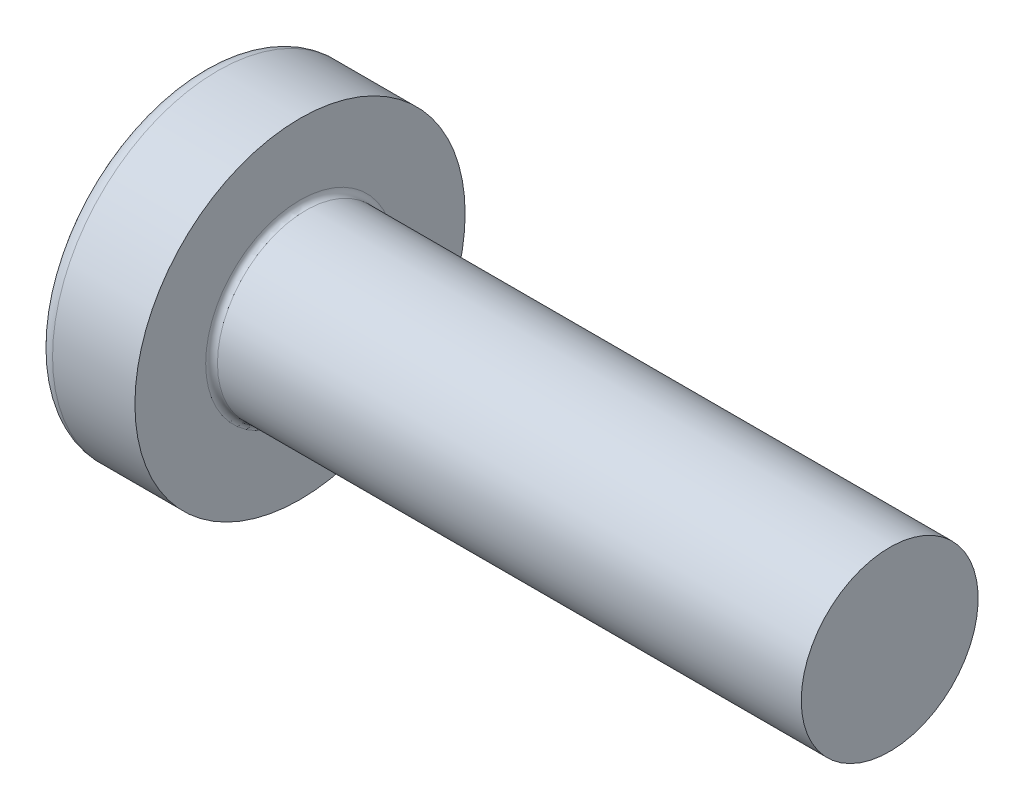
ISO-10303-21;
HEADER;
FILE_DESCRIPTION(('STEP AP214'),'2;1');
FILE_NAME('part.step','',(''),(''),'','','');
FILE_SCHEMA(('AUTOMOTIVE_DESIGN { 1 0 10303 214 1 1 1 1 }'));
ENDSEC;
DATA;
#1=APPLICATION_CONTEXT('core data for automotive mechanical design processes');
#2=APPLICATION_PROTOCOL_DEFINITION('international standard','automotive_design',2000,#1);
#3=PRODUCT_CONTEXT('',#1,'mechanical');
#4=PRODUCT('Part','Part','',(#3));
#5=PRODUCT_RELATED_PRODUCT_CATEGORY('part','',(#4));
#6=PRODUCT_DEFINITION_FORMATION('','',#4);
#7=PRODUCT_DEFINITION_CONTEXT('part definition',#1,'design');
#8=PRODUCT_DEFINITION('design','',#6,#7);
#9=PRODUCT_DEFINITION_SHAPE('','',#8);
#10=(LENGTH_UNIT() NAMED_UNIT(*) SI_UNIT(.MILLI.,.METRE.));
#11=(NAMED_UNIT(*) PLANE_ANGLE_UNIT() SI_UNIT($,.RADIAN.));
#12=(NAMED_UNIT(*) SI_UNIT($,.STERADIAN.) SOLID_ANGLE_UNIT());
#13=UNCERTAINTY_MEASURE_WITH_UNIT(LENGTH_MEASURE(1.E-05),#10,'distance_accuracy_value','');
#14=(GEOMETRIC_REPRESENTATION_CONTEXT(3) GLOBAL_UNCERTAINTY_ASSIGNED_CONTEXT((#13)) GLOBAL_UNIT_ASSIGNED_CONTEXT((#10,
#11,#12)) REPRESENTATION_CONTEXT('',''));
#15=CARTESIAN_POINT('',(0.,0.,0.));
#16=DIRECTION('',(0.,0.,1.));
#17=DIRECTION('',(1.,0.,0.));
#18=AXIS2_PLACEMENT_3D('',#15,#16,#17);
#19=CARTESIAN_POINT('',(5.,0.,0.));
#20=DIRECTION('',(-1.,0.,0.));
#21=DIRECTION('',(0.,1.,0.));
#22=AXIS2_PLACEMENT_3D('',#19,#20,#21);
#23=SPHERICAL_SURFACE('',#22,5.);
#24=CARTESIAN_POINT('',(0.775371598933733,0.,0.));
#25=DIRECTION('',(-1.,0.,0.));
#26=DIRECTION('',(0.,0.,1.));
#27=AXIS2_PLACEMENT_3D('',#24,#25,#26);
#28=CIRCLE('',#27,2.67441860465116);
#29=CARTESIAN_POINT('',(0.775371598933733,0.,2.67441860465116));
#30=VERTEX_POINT('',#29);
#31=EDGE_CURVE('E240',#30,#30,#28,.T.);
#32=ORIENTED_EDGE('',*,*,#31,.T.);
#33=EDGE_LOOP('',(#32));
#34=FACE_BOUND('',#33,.T.);
#35=CARTESIAN_POINT('',(0.0457951200896417,0.,0.));
#36=DIRECTION('',(1.,0.,0.));
#37=DIRECTION('',(0.,0.,-1.));
#38=AXIS2_PLACEMENT_3D('',#35,#36,#37);
#39=CIRCLE('',#38,0.675169614150692);
#40=CARTESIAN_POINT('',(0.0457951200896417,-0.369999999999998,-0.564760133040918));
#41=VERTEX_POINT('',#40);
#42=CARTESIAN_POINT('',(0.0457951200896422,-0.564760133040923,-0.37));
#43=VERTEX_POINT('',#42);
#44=EDGE_CURVE('E376',#41,#43,#39,.F.);
#45=ORIENTED_EDGE('',*,*,#44,.F.);
#46=CARTESIAN_POINT('',(5.,-0.37,0.));
#47=DIRECTION('',(0.,1.,0.));
#48=DIRECTION('',(0.,0.,1.));
#49=AXIS2_PLACEMENT_3D('',#46,#47,#48);
#50=CIRCLE('',#49,4.98629120689917);
#51=CARTESIAN_POINT('',(0.187869734228639,-0.369999999999995,-1.30633162146802));
#52=VERTEX_POINT('',#51);
#53=EDGE_CURVE('E302',#52,#41,#50,.T.);
#54=ORIENTED_EDGE('',*,*,#53,.F.);
#55=CARTESIAN_POINT('',(4.56358262530798,0.,0.87531798330592));
#56=DIRECTION('',(0.446197753347436,0.,-0.894934391398443));
#57=DIRECTION('',(-0.894934391398442,0.,-0.446197753347436));
#58=AXIS2_PLACEMENT_3D('',#55,#56,#57);
#59=CIRCLE('',#58,4.90340272700175);
#60=CARTESIAN_POINT('',(0.187869734228639,0.370000000000005,-1.30633162146802));
#61=VERTEX_POINT('',#60);
#62=EDGE_CURVE('E274',#52,#61,#59,.T.);
#63=ORIENTED_EDGE('',*,*,#62,.T.);
#64=CARTESIAN_POINT('',(5.,0.37,0.));
#65=DIRECTION('',(0.,-1.,0.));
#66=DIRECTION('',(0.,0.,-1.));
#67=AXIS2_PLACEMENT_3D('',#64,#65,#66);
#68=CIRCLE('',#67,4.98629120689917);
#69=CARTESIAN_POINT('',(0.0457951200896407,0.370000000000002,-0.564760133040916));
#70=VERTEX_POINT('',#69);
#71=EDGE_CURVE('E329',#70,#61,#68,.T.);
#72=ORIENTED_EDGE('',*,*,#71,.F.);
#73=CARTESIAN_POINT('',(0.0457951200896422,0.564760133040923,-0.37));
#74=VERTEX_POINT('',#73);
#75=EDGE_CURVE('E395',#74,#70,#39,.F.);
#76=ORIENTED_EDGE('',*,*,#75,.F.);
#77=CARTESIAN_POINT('',(5.,0.,-0.37));
#78=DIRECTION('',(0.,0.,1.));
#79=DIRECTION('',(1.,0.,0.));
#80=AXIS2_PLACEMENT_3D('',#77,#78,#79);
#81=CIRCLE('',#80,4.98629120689917);
#82=CARTESIAN_POINT('',(0.187869734228639,1.30633162146802,-0.37));
#83=VERTEX_POINT('',#82);
#84=EDGE_CURVE('E268',#83,#74,#81,.T.);
#85=ORIENTED_EDGE('',*,*,#84,.F.);
#86=CARTESIAN_POINT('',(4.56358262530798,-0.875317983305919,0.));
#87=DIRECTION('',(0.446197753347436,0.894934391398443,0.));
#88=DIRECTION('',(-0.894934391398443,0.446197753347436,0.));
#89=AXIS2_PLACEMENT_3D('',#86,#87,#88);
#90=CIRCLE('',#89,4.90340272700175);
#91=CARTESIAN_POINT('',(0.187869734228639,1.30633162146802,0.37));
#92=VERTEX_POINT('',#91);
#93=EDGE_CURVE('E271',#83,#92,#90,.T.);
#94=ORIENTED_EDGE('',*,*,#93,.T.);
#95=CARTESIAN_POINT('',(5.,0.,0.37));
#96=DIRECTION('',(0.,0.,-1.));
#97=DIRECTION('',(0.,1.,0.));
#98=AXIS2_PLACEMENT_3D('',#95,#96,#97);
#99=CIRCLE('',#98,4.98629120689917);
#100=CARTESIAN_POINT('',(0.0457951200896417,0.564760133040918,0.37));
#101=VERTEX_POINT('',#100);
#102=EDGE_CURVE('E264',#101,#92,#99,.T.);
#103=ORIENTED_EDGE('',*,*,#102,.F.);
#104=CARTESIAN_POINT('',(0.0457951200896417,0.369999999999998,0.564760133040918));
#105=VERTEX_POINT('',#104);
#106=EDGE_CURVE('E394',#105,#101,#39,.F.);
#107=ORIENTED_EDGE('',*,*,#106,.F.);
#108=CARTESIAN_POINT('',(0.187869734228639,0.369999999999995,1.30633162146802));
#109=VERTEX_POINT('',#108);
#110=EDGE_CURVE('E284',#109,#105,#68,.T.);
#111=ORIENTED_EDGE('',*,*,#110,.F.);
#112=CARTESIAN_POINT('',(4.56358262530798,0.,-0.875317983305919));
#113=DIRECTION('',(0.446197753347436,0.,0.894934391398443));
#114=DIRECTION('',(0.894934391398443,0.,-0.446197753347436));
#115=AXIS2_PLACEMENT_3D('',#112,#113,#114);
#116=CIRCLE('',#115,4.90340272700175);
#117=CARTESIAN_POINT('',(0.187869734228639,-0.370000000000004,1.30633162146802));
#118=VERTEX_POINT('',#117);
#119=EDGE_CURVE('E51',#109,#118,#116,.T.);
#120=ORIENTED_EDGE('',*,*,#119,.T.);
#121=CARTESIAN_POINT('',(0.0457951200896412,-0.370000000000002,0.564760133040916));
#122=VERTEX_POINT('',#121);
#123=EDGE_CURVE('E281',#122,#118,#50,.T.);
#124=ORIENTED_EDGE('',*,*,#123,.F.);
#125=CARTESIAN_POINT('',(0.0457951200896417,-0.564760133040919,0.37));
#126=VERTEX_POINT('',#125);
#127=EDGE_CURVE('E430',#126,#122,#39,.F.);
#128=ORIENTED_EDGE('',*,*,#127,.F.);
#129=CARTESIAN_POINT('',(0.187869734228639,-1.30633162146802,0.37));
#130=VERTEX_POINT('',#129);
#131=EDGE_CURVE('E265',#130,#126,#99,.T.);
#132=ORIENTED_EDGE('',*,*,#131,.F.);
#133=CARTESIAN_POINT('',(4.56358262530798,0.87531798330592,0.));
#134=DIRECTION('',(0.446197753347436,-0.894934391398443,0.));
#135=DIRECTION('',(0.894934391398442,0.446197753347436,0.));
#136=AXIS2_PLACEMENT_3D('',#133,#134,#135);
#137=CIRCLE('',#136,4.90340272700175);
#138=CARTESIAN_POINT('',(0.187869734228639,-1.30633162146802,-0.37));
#139=VERTEX_POINT('',#138);
#140=EDGE_CURVE('E261',#130,#139,#137,.T.);
#141=ORIENTED_EDGE('',*,*,#140,.T.);
#142=EDGE_CURVE('E66',#43,#139,#81,.T.);
#143=ORIENTED_EDGE('',*,*,#142,.F.);
#144=EDGE_LOOP('',(#45,#54,#63,#72,#76,#85,#94,#103,#107,#111,#120,#124,#128,#132,#141,#143));
#145=FACE_BOUND('',#144,.T.);
#146=ADVANCED_FACE('F38',(#34,#145),#23,.T.);
#147=CARTESIAN_POINT('',(1.75,0.527482331818931,-0.37));
#148=DIRECTION('',(0.,0.,1.));
#149=DIRECTION('',(1.,0.,0.));
#150=AXIS2_PLACEMENT_3D('',#147,#148,#149);
#151=PLANE('',#150);
#152=ORIENTED_EDGE('',*,*,#84,.T.);
#153=CARTESIAN_POINT('',(-0.987293237053717,0.649401255967161,-0.37));
#154=CARTESIAN_POINT('',(-0.781914975317086,0.632865887002871,-0.37));
#155=CARTESIAN_POINT('',(-0.576547882393374,0.616188977635081,-0.37));
#156=CARTESIAN_POINT('',(-0.165841599226328,0.582441031964227,-0.37));
#157=CARTESIAN_POINT('',(0.0394975903090438,0.56536998705488,-0.37));
#158=CARTESIAN_POINT('',(0.450133475422571,0.530723441326535,-0.37));
#159=CARTESIAN_POINT('',(0.655430171010572,0.513147940624557,-0.37));
#160=CARTESIAN_POINT('',(1.06596140177933,0.477314957985794,-0.37));
#161=CARTESIAN_POINT('',(1.2711959378071,0.459057485806066,-0.37));
#162=CARTESIAN_POINT('',(1.61065292365625,0.428051938688769,-0.37));
#163=CARTESIAN_POINT('',(1.74490059995642,0.415580824990931,-0.37));
#164=CARTESIAN_POINT('',(2.01334321762763,0.39009202340498,-0.37));
#165=CARTESIAN_POINT('',(2.14753815934577,0.377074339177354,-0.37));
#166=CARTESIAN_POINT('',(2.41586354151957,0.350315629452843,-0.37));
#167=CARTESIAN_POINT('',(2.54999397845309,0.33657456817765,-0.37));
#168=CARTESIAN_POINT('',(2.81814173295471,0.308004077741875,-0.37));
#169=CARTESIAN_POINT('',(2.95215904765134,0.293174621747065,-0.37));
#170=CARTESIAN_POINT('',(3.0860955068368,0.277618485071816,-0.37));
#171=B_SPLINE_CURVE_WITH_KNOTS('',3,(#153,#154,#155,#156,#157,#158,#159,#160,#161,#162,#163,
#164,#165,#166,#167,#168,#169,#170),.UNSPECIFIED.,.F.,.F.,(4,2,2,2,2,2,2,2,4),(0.,
0.618128793984691,1.23627109812525,1.85441325887562,2.4725465791681,2.87702276218609,
3.28149623678161,3.68598973550942,4.09049321032311),.UNSPECIFIED.);
#172=CARTESIAN_POINT('',(1.75,0.415013252800437,-0.37));
#173=VERTEX_POINT('',#172);
#174=EDGE_CURVE('E416',#74,#173,#171,.T.);
#175=ORIENTED_EDGE('',*,*,#174,.T.);
#176=DIRECTION('',(0.,1.,0.));
#177=VECTOR('',#176,1.);
#178=CARTESIAN_POINT('',(1.75,-0.527482331818931,-0.37));
#179=LINE('',#178,#177);
#180=CARTESIAN_POINT('',(1.75,0.527482331818932,-0.37));
#181=VERTEX_POINT('',#180);
#182=EDGE_CURVE('E358',#173,#181,#179,.T.);
#183=ORIENTED_EDGE('',*,*,#182,.T.);
#184=DIRECTION('',(0.894934391398442,-0.446197753347436,0.));
#185=VECTOR('',#184,1.);
#186=CARTESIAN_POINT('',(0.,1.4,-0.37));
#187=LINE('',#186,#185);
#188=EDGE_CURVE('E241',#83,#181,#187,.T.);
#189=ORIENTED_EDGE('',*,*,#188,.F.);
#190=EDGE_LOOP('',(#152,#175,#183,#189));
#191=FACE_BOUND('',#190,.T.);
#192=ADVANCED_FACE('F196',(#191),#151,.T.);
#193=CARTESIAN_POINT('',(1.75,-0.527482331818931,-0.37));
#194=VERTEX_POINT('',#193);
#195=CARTESIAN_POINT('',(1.75,-0.415013252800437,-0.37));
#196=VERTEX_POINT('',#195);
#197=EDGE_CURVE('E249',#194,#196,#179,.T.);
#198=ORIENTED_EDGE('',*,*,#197,.T.);
#199=CARTESIAN_POINT('',(-0.987293237053717,-0.649401255967161,-0.37));
#200=CARTESIAN_POINT('',(-0.781914975317086,-0.632865887002871,-0.37));
#201=CARTESIAN_POINT('',(-0.576547882393374,-0.616188977635081,-0.37));
#202=CARTESIAN_POINT('',(-0.165841599226328,-0.582441031964227,-0.37));
#203=CARTESIAN_POINT('',(0.0394975903090437,-0.56536998705488,-0.37));
#204=CARTESIAN_POINT('',(0.450133475422571,-0.530723441326535,-0.37));
#205=CARTESIAN_POINT('',(0.655430171010572,-0.513147940624557,-0.37));
#206=CARTESIAN_POINT('',(1.06596140177933,-0.477314957985794,-0.37));
#207=CARTESIAN_POINT('',(1.2711959378071,-0.459057485806066,-0.37));
#208=CARTESIAN_POINT('',(1.61065292365625,-0.428051938688769,-0.37));
#209=CARTESIAN_POINT('',(1.74490059995642,-0.415580824990931,-0.37));
#210=CARTESIAN_POINT('',(2.01334321762763,-0.39009202340498,-0.37));
#211=CARTESIAN_POINT('',(2.14753815934577,-0.377074339177353,-0.37));
#212=CARTESIAN_POINT('',(2.41586354151957,-0.350315629452843,-0.37));
#213=CARTESIAN_POINT('',(2.5499939784531,-0.33657456817765,-0.37));
#214=CARTESIAN_POINT('',(2.81814173295471,-0.308004077741875,-0.37));
#215=CARTESIAN_POINT('',(2.95215904765134,-0.293174621747065,-0.37));
#216=CARTESIAN_POINT('',(3.0860955068368,-0.277618485071816,-0.37));
#217=B_SPLINE_CURVE_WITH_KNOTS('',3,(#199,#200,#201,#202,#203,#204,#205,#206,#207,#208,#209,
#210,#211,#212,#213,#214,#215,#216),.UNSPECIFIED.,.F.,.F.,(4,2,2,2,2,2,2,2,4),(0.,
0.618128793984691,1.23627109812525,1.85441325887562,2.4725465791681,2.87702276218609,
3.28149623678161,3.68598973550942,4.09049321032311),.UNSPECIFIED.);
#218=EDGE_CURVE('E393',#196,#43,#217,.F.);
#219=ORIENTED_EDGE('',*,*,#218,.T.);
#220=ORIENTED_EDGE('',*,*,#142,.T.);
#221=DIRECTION('',(0.894934391398442,0.446197753347436,0.));
#222=VECTOR('',#221,1.);
#223=CARTESIAN_POINT('',(0.,-1.4,-0.37));
#224=LINE('',#223,#222);
#225=EDGE_CURVE('E332',#139,#194,#224,.T.);
#226=ORIENTED_EDGE('',*,*,#225,.T.);
#227=EDGE_LOOP('',(#198,#219,#220,#226));
#228=FACE_BOUND('',#227,.T.);
#229=ADVANCED_FACE('F202',(#228),#151,.T.);
#230=CARTESIAN_POINT('',(1.75,-0.527482331818931,0.37));
#231=DIRECTION('',(0.,0.,-1.));
#232=DIRECTION('',(0.,1.,0.));
#233=AXIS2_PLACEMENT_3D('',#230,#231,#232);
#234=PLANE('',#233);
#235=DIRECTION('',(0.,-1.,0.));
#236=VECTOR('',#235,1.);
#237=CARTESIAN_POINT('',(1.75,0.527482331818931,0.37));
#238=LINE('',#237,#236);
#239=CARTESIAN_POINT('',(1.75,0.527482331818932,0.37));
#240=VERTEX_POINT('',#239);
#241=CARTESIAN_POINT('',(1.75,0.415013252800437,0.37));
#242=VERTEX_POINT('',#241);
#243=EDGE_CURVE('E341',#240,#242,#238,.T.);
#244=ORIENTED_EDGE('',*,*,#243,.T.);
#245=CARTESIAN_POINT('',(-0.987293237053717,0.649401255967161,0.37));
#246=CARTESIAN_POINT('',(-0.781914975317086,0.632865887002871,0.37));
#247=CARTESIAN_POINT('',(-0.576547882393374,0.616188977635081,0.37));
#248=CARTESIAN_POINT('',(-0.165841599226328,0.582441031964227,0.37));
#249=CARTESIAN_POINT('',(0.0394975903090437,0.56536998705488,0.37));
#250=CARTESIAN_POINT('',(0.450133475422571,0.530723441326535,0.37));
#251=CARTESIAN_POINT('',(0.655430171010572,0.513147940624557,0.37));
#252=CARTESIAN_POINT('',(1.06596140177933,0.477314957985794,0.37));
#253=CARTESIAN_POINT('',(1.2711959378071,0.459057485806066,0.37));
#254=CARTESIAN_POINT('',(1.61065292365625,0.428051938688769,0.37));
#255=CARTESIAN_POINT('',(1.74490059995642,0.415580824990931,0.37));
#256=CARTESIAN_POINT('',(2.01334321762763,0.39009202340498,0.37));
#257=CARTESIAN_POINT('',(2.14753815934577,0.377074339177353,0.37));
#258=CARTESIAN_POINT('',(2.41586354151957,0.350315629452843,0.37));
#259=CARTESIAN_POINT('',(2.5499939784531,0.33657456817765,0.37));
#260=CARTESIAN_POINT('',(2.81814173295471,0.308004077741875,0.37));
#261=CARTESIAN_POINT('',(2.95215904765134,0.293174621747065,0.37));
#262=CARTESIAN_POINT('',(3.0860955068368,0.277618485071816,0.37));
#263=B_SPLINE_CURVE_WITH_KNOTS('',3,(#245,#246,#247,#248,#249,#250,#251,#252,#253,#254,#255,
#256,#257,#258,#259,#260,#261,#262),.UNSPECIFIED.,.F.,.F.,(4,2,2,2,2,2,2,2,4),(0.,
0.618128793984691,1.23627109812525,1.85441325887562,2.4725465791681,2.87702276218609,
3.28149623678161,3.68598973550942,4.09049321032311),.UNSPECIFIED.);
#264=EDGE_CURVE('E670',#242,#101,#263,.F.);
#265=ORIENTED_EDGE('',*,*,#264,.T.);
#266=ORIENTED_EDGE('',*,*,#102,.T.);
#267=DIRECTION('',(0.894934391398442,-0.446197753347436,0.));
#268=VECTOR('',#267,1.);
#269=CARTESIAN_POINT('',(0.,1.4,0.37));
#270=LINE('',#269,#268);
#271=EDGE_CURVE('E246',#92,#240,#270,.T.);
#272=ORIENTED_EDGE('',*,*,#271,.T.);
#273=EDGE_LOOP('',(#244,#265,#266,#272));
#274=FACE_BOUND('',#273,.T.);
#275=ADVANCED_FACE('F412',(#274),#234,.T.);
#276=ORIENTED_EDGE('',*,*,#131,.T.);
#277=CARTESIAN_POINT('',(-0.987293237069636,-0.649401255968442,0.37));
#278=CARTESIAN_POINT('',(-0.781914975331303,-0.632865887004023,0.37));
#279=CARTESIAN_POINT('',(-0.576547882405889,-0.616188977636102,0.37));
#280=CARTESIAN_POINT('',(-0.165841599235441,-0.582441031964983,0.37));
#281=CARTESIAN_POINT('',(0.0394975903016323,-0.5653699870555,0.37));
#282=CARTESIAN_POINT('',(0.4501334754206,-0.530723441326706,0.37));
#283=CARTESIAN_POINT('',(0.655430171012339,-0.513147940624409,0.37));
#284=CARTESIAN_POINT('',(1.06596140178858,-0.477314957984981,0.37));
#285=CARTESIAN_POINT('',(1.27119593782008,-0.459057485804908,0.37));
#286=CARTESIAN_POINT('',(1.61065292367297,-0.428051938687225,0.37));
#287=CARTESIAN_POINT('',(1.74490059997313,-0.415580824989368,0.37));
#288=CARTESIAN_POINT('',(2.01334321764434,-0.390092023403371,0.37));
#289=CARTESIAN_POINT('',(2.14753815936247,-0.377074339175718,0.37));
#290=CARTESIAN_POINT('',(2.41586354153627,-0.350315629451146,0.37));
#291=CARTESIAN_POINT('',(2.54999397846979,-0.336574568175918,0.37));
#292=CARTESIAN_POINT('',(2.8181417329714,-0.308004077740054,0.37));
#293=CARTESIAN_POINT('',(2.95215904766802,-0.29317462174519,0.37));
#294=CARTESIAN_POINT('',(3.08609550685347,-0.277618485069873,0.37));
#295=B_SPLINE_CURVE_WITH_KNOTS('',3,(#277,#278,#279,#280,#281,#282,#283,#284,#285,#286,#287,
#288,#289,#290,#291,#292,#293,#294),.UNSPECIFIED.,.F.,.F.,(4,2,2,2,2,2,2,2,4),(0.,
0.618128793989811,1.23627109813549,1.85441325889711,2.47254657920086,2.87702276221884,
3.28149623681437,3.68598973554218,4.09049321035586),.UNSPECIFIED.);
#296=CARTESIAN_POINT('',(1.75,-0.415013252800437,0.37));
#297=VERTEX_POINT('',#296);
#298=EDGE_CURVE('E431',#126,#297,#295,.T.);
#299=ORIENTED_EDGE('',*,*,#298,.T.);
#300=CARTESIAN_POINT('',(1.75,-0.527482331818931,0.37));
#301=VERTEX_POINT('',#300);
#302=EDGE_CURVE('E343',#297,#301,#238,.T.);
#303=ORIENTED_EDGE('',*,*,#302,.T.);
#304=DIRECTION('',(0.894934391398442,0.446197753347436,0.));
#305=VECTOR('',#304,1.);
#306=CARTESIAN_POINT('',(0.,-1.4,0.37));
#307=LINE('',#306,#305);
#308=EDGE_CURVE('E334',#130,#301,#307,.T.);
#309=ORIENTED_EDGE('',*,*,#308,.F.);
#310=EDGE_LOOP('',(#276,#299,#303,#309));
#311=FACE_BOUND('',#310,.T.);
#312=ADVANCED_FACE('F516',(#311),#234,.T.);
#313=CARTESIAN_POINT('',(1.75,0.527482331818931,0.37));
#314=DIRECTION('',(0.446197753347436,0.894934391398443,0.));
#315=DIRECTION('',(-0.894934391398443,0.446197753347436,0.));
#316=AXIS2_PLACEMENT_3D('',#313,#314,#315);
#317=PLANE('',#316);
#318=CARTESIAN_POINT('',(2.6696526882832,0.0689604923233251,0.));
#319=DIRECTION('',(0.446197753347436,0.894934391398443,0.));
#320=DIRECTION('',(-0.894934391398443,0.446197753347436,0.));
#321=AXIS2_PLACEMENT_3D('',#318,#319,#320);
#322=ELLIPSE('',#321,1.10195897609154,0.486831694838766);
#323=CARTESIAN_POINT('',(1.75,0.527482331818932,0.175779377683681));
#324=VERTEX_POINT('',#323);
#325=CARTESIAN_POINT('',(1.75,0.527482331818932,-0.175779377683681));
#326=VERTEX_POINT('',#325);
#327=EDGE_CURVE('E307',#324,#326,#322,.F.);
#328=ORIENTED_EDGE('',*,*,#327,.F.);
#329=DIRECTION('',(0.,0.,-1.));
#330=VECTOR('',#329,1.);
#331=CARTESIAN_POINT('',(1.75,0.527482331818931,0.37));
#332=LINE('',#331,#330);
#333=EDGE_CURVE('E344',#240,#324,#332,.T.);
#334=ORIENTED_EDGE('',*,*,#333,.F.);
#335=ORIENTED_EDGE('',*,*,#271,.F.);
#336=ORIENTED_EDGE('',*,*,#93,.F.);
#337=ORIENTED_EDGE('',*,*,#188,.T.);
#338=EDGE_CURVE('E346',#326,#181,#332,.T.);
#339=ORIENTED_EDGE('',*,*,#338,.F.);
#340=EDGE_LOOP('',(#328,#334,#335,#336,#337,#339));
#341=FACE_BOUND('',#340,.T.);
#342=ADVANCED_FACE('F410',(#341),#317,.F.);
#343=CARTESIAN_POINT('',(0.,-1.4,-0.37));
#344=DIRECTION('',(0.446197753347436,-0.894934391398443,0.));
#345=DIRECTION('',(0.894934391398442,0.446197753347436,0.));
#346=AXIS2_PLACEMENT_3D('',#343,#344,#345);
#347=PLANE('',#346);
#348=CARTESIAN_POINT('',(2.6696526882832,-0.0689604923233248,0.));
#349=DIRECTION('',(0.446197753347436,-0.894934391398443,0.));
#350=DIRECTION('',(-0.894934391398443,-0.446197753347436,0.));
#351=AXIS2_PLACEMENT_3D('',#348,#349,#350);
#352=ELLIPSE('',#351,1.10195897609154,0.486831694838766);
#353=CARTESIAN_POINT('',(1.75,-0.527482331818932,-0.175779377683682));
#354=VERTEX_POINT('',#353);
#355=CARTESIAN_POINT('',(1.75,-0.527482331818932,0.175779377683682));
#356=VERTEX_POINT('',#355);
#357=EDGE_CURVE('E672',#354,#356,#352,.F.);
#358=ORIENTED_EDGE('',*,*,#357,.F.);
#359=DIRECTION('',(0.,0.,1.));
#360=VECTOR('',#359,1.);
#361=CARTESIAN_POINT('',(1.75,-0.527482331818931,-0.37));
#362=LINE('',#361,#360);
#363=EDGE_CURVE('E337',#194,#354,#362,.T.);
#364=ORIENTED_EDGE('',*,*,#363,.F.);
#365=ORIENTED_EDGE('',*,*,#225,.F.);
#366=ORIENTED_EDGE('',*,*,#140,.F.);
#367=ORIENTED_EDGE('',*,*,#308,.T.);
#368=EDGE_CURVE('E340',#356,#301,#362,.T.);
#369=ORIENTED_EDGE('',*,*,#368,.F.);
#370=EDGE_LOOP('',(#358,#364,#365,#366,#367,#369));
#371=FACE_BOUND('',#370,.T.);
#372=ADVANCED_FACE('F503',(#371),#347,.F.);
#373=CARTESIAN_POINT('',(1.75,0.527482331818931,-0.37));
#374=DIRECTION('',(-1.,0.,0.));
#375=DIRECTION('',(0.,0.,1.));
#376=AXIS2_PLACEMENT_3D('',#373,#374,#375);
#377=PLANE('',#376);
#378=DIRECTION('',(0.,1.,0.));
#379=VECTOR('',#378,1.);
#380=CARTESIAN_POINT('',(1.75,-0.370000000000002,0.52748233181893));
#381=LINE('',#380,#379);
#382=CARTESIAN_POINT('',(1.75,-0.370000000000002,0.52748233181893));
#383=VERTEX_POINT('',#382);
#384=CARTESIAN_POINT('',(1.75,-0.175779377683684,0.527482331818931));
#385=VERTEX_POINT('',#384);
#386=EDGE_CURVE('E322',#383,#385,#381,.T.);
#387=ORIENTED_EDGE('',*,*,#386,.T.);
#388=CARTESIAN_POINT('',(1.75,0.,0.));
#389=DIRECTION('',(-1.,0.,0.));
#390=DIRECTION('',(0.,0.,1.));
#391=AXIS2_PLACEMENT_3D('',#388,#389,#390);
#392=CIRCLE('',#391,0.556);
#393=CARTESIAN_POINT('',(1.75,-0.370000000000001,0.415013252800436));
#394=VERTEX_POINT('',#393);
#395=EDGE_CURVE('E698',#394,#385,#392,.T.);
#396=ORIENTED_EDGE('',*,*,#395,.F.);
#397=DIRECTION('',(0.,0.,-1.));
#398=VECTOR('',#397,1.);
#399=CARTESIAN_POINT('',(1.75,-0.370000000000002,0.52748233181893));
#400=LINE('',#399,#398);
#401=EDGE_CURVE('E318',#383,#394,#400,.T.);
#402=ORIENTED_EDGE('',*,*,#401,.F.);
#403=EDGE_LOOP('',(#387,#396,#402));
#404=FACE_BOUND('',#403,.T.);
#405=ADVANCED_FACE('F496',(#404),#377,.T.);
#406=ORIENTED_EDGE('',*,*,#302,.F.);
#407=EDGE_CURVE('E703',#356,#297,#392,.T.);
#408=ORIENTED_EDGE('',*,*,#407,.F.);
#409=ORIENTED_EDGE('',*,*,#368,.T.);
#410=EDGE_LOOP('',(#406,#408,#409));
#411=FACE_BOUND('',#410,.T.);
#412=ADVANCED_FACE('F489',(#411),#377,.T.);
#413=ORIENTED_EDGE('',*,*,#363,.T.);
#414=EDGE_CURVE('E387',#196,#354,#392,.T.);
#415=ORIENTED_EDGE('',*,*,#414,.F.);
#416=ORIENTED_EDGE('',*,*,#197,.F.);
#417=EDGE_LOOP('',(#413,#415,#416));
#418=FACE_BOUND('',#417,.T.);
#419=ADVANCED_FACE('F483',(#418),#377,.T.);
#420=CARTESIAN_POINT('',(1.75,-0.369999999999998,-0.415013252800438));
#421=VERTEX_POINT('',#420);
#422=CARTESIAN_POINT('',(1.75,-0.369999999999998,-0.527482331818932));
#423=VERTEX_POINT('',#422);
#424=EDGE_CURVE('E321',#421,#423,#400,.T.);
#425=ORIENTED_EDGE('',*,*,#424,.F.);
#426=CARTESIAN_POINT('',(1.75,-0.175779377683682,-0.527482331818932));
#427=VERTEX_POINT('',#426);
#428=EDGE_CURVE('E58',#427,#421,#392,.T.);
#429=ORIENTED_EDGE('',*,*,#428,.F.);
#430=DIRECTION('',(0.,-1.,0.));
#431=VECTOR('',#430,1.);
#432=CARTESIAN_POINT('',(1.75,0.370000000000002,-0.52748233181893));
#433=LINE('',#432,#431);
#434=EDGE_CURVE('E317',#427,#423,#433,.T.);
#435=ORIENTED_EDGE('',*,*,#434,.T.);
#436=EDGE_LOOP('',(#425,#429,#435));
#437=FACE_BOUND('',#436,.T.);
#438=ADVANCED_FACE('F382',(#437),#377,.T.);
#439=CARTESIAN_POINT('',(1.75,0.370000000000002,-0.52748233181893));
#440=VERTEX_POINT('',#439);
#441=CARTESIAN_POINT('',(1.75,0.175779377683685,-0.527482331818931));
#442=VERTEX_POINT('',#441);
#443=EDGE_CURVE('E314',#440,#442,#433,.T.);
#444=ORIENTED_EDGE('',*,*,#443,.T.);
#445=CARTESIAN_POINT('',(1.75,0.370000000000001,-0.415013252800436));
#446=VERTEX_POINT('',#445);
#447=EDGE_CURVE('E386',#446,#442,#392,.T.);
#448=ORIENTED_EDGE('',*,*,#447,.F.);
#449=DIRECTION('',(0.,0.,1.));
#450=VECTOR('',#449,1.);
#451=CARTESIAN_POINT('',(1.75,0.370000000000002,-0.52748233181893));
#452=LINE('',#451,#450);
#453=EDGE_CURVE('E326',#440,#446,#452,.T.);
#454=ORIENTED_EDGE('',*,*,#453,.F.);
#455=EDGE_LOOP('',(#444,#448,#454));
#456=FACE_BOUND('',#455,.T.);
#457=ADVANCED_FACE('F471',(#456),#377,.T.);
#458=ORIENTED_EDGE('',*,*,#182,.F.);
#459=EDGE_CURVE('E687',#326,#173,#392,.T.);
#460=ORIENTED_EDGE('',*,*,#459,.F.);
#461=ORIENTED_EDGE('',*,*,#338,.T.);
#462=EDGE_LOOP('',(#458,#460,#461));
#463=FACE_BOUND('',#462,.T.);
#464=ADVANCED_FACE('F464',(#463),#377,.T.);
#465=ORIENTED_EDGE('',*,*,#333,.T.);
#466=EDGE_CURVE('E689',#242,#324,#392,.T.);
#467=ORIENTED_EDGE('',*,*,#466,.F.);
#468=ORIENTED_EDGE('',*,*,#243,.F.);
#469=EDGE_LOOP('',(#465,#467,#468));
#470=FACE_BOUND('',#469,.T.);
#471=ADVANCED_FACE('F458',(#470),#377,.T.);
#472=CARTESIAN_POINT('',(1.75,0.369999999999998,0.527482331818933));
#473=DIRECTION('',(0.,-1.,0.));
#474=DIRECTION('',(1.,0.,0.));
#475=AXIS2_PLACEMENT_3D('',#472,#473,#474);
#476=PLANE('',#475);
#477=ORIENTED_EDGE('',*,*,#110,.T.);
#478=CARTESIAN_POINT('',(-0.987293237069636,0.369999999999998,0.649401255968443));
#479=CARTESIAN_POINT('',(-0.781914975331303,0.369999999999998,0.632865887004024));
#480=CARTESIAN_POINT('',(-0.576547882405889,0.369999999999998,0.616188977636103));
#481=CARTESIAN_POINT('',(-0.165841599235441,0.369999999999998,0.582441031964984));
#482=CARTESIAN_POINT('',(0.0394975903016326,0.369999999999998,0.565369987055501));
#483=CARTESIAN_POINT('',(0.4501334754206,0.369999999999998,0.530723441326707));
#484=CARTESIAN_POINT('',(0.655430171012339,0.369999999999998,0.51314794062441));
#485=CARTESIAN_POINT('',(1.06596140178858,0.369999999999998,0.477314957984982));
#486=CARTESIAN_POINT('',(1.27119593782008,0.369999999999998,0.459057485804909));
#487=CARTESIAN_POINT('',(1.61065292367297,0.369999999999998,0.428051938687226));
#488=CARTESIAN_POINT('',(1.74490059997313,0.369999999999999,0.415580824989369));
#489=CARTESIAN_POINT('',(2.01334321764434,0.369999999999999,0.390092023403372));
#490=CARTESIAN_POINT('',(2.14753815936247,0.369999999999999,0.37707433917572));
#491=CARTESIAN_POINT('',(2.41586354153627,0.369999999999999,0.350315629451147));
#492=CARTESIAN_POINT('',(2.54999397846979,0.369999999999999,0.336574568175919));
#493=CARTESIAN_POINT('',(2.8181417329714,0.369999999999999,0.308004077740055));
#494=CARTESIAN_POINT('',(2.95215904766802,0.369999999999999,0.293174621745191));
#495=CARTESIAN_POINT('',(3.08609550685347,0.369999999999999,0.277618485069875));
#496=B_SPLINE_CURVE_WITH_KNOTS('',3,(#478,#479,#480,#481,#482,#483,#484,#485,#486,#487,#488,
#489,#490,#491,#492,#493,#494,#495),.UNSPECIFIED.,.F.,.F.,(4,2,2,2,2,2,2,2,4),(0.,
0.61812879398981,1.23627109813549,1.85441325889711,2.47254657920086,2.87702276221884,
3.28149623681436,3.68598973554218,4.09049321035586),.UNSPECIFIED.);
#497=CARTESIAN_POINT('',(1.75,0.369999999999999,0.415013252800439));
#498=VERTEX_POINT('',#497);
#499=EDGE_CURVE('E669',#105,#498,#496,.T.);
#500=ORIENTED_EDGE('',*,*,#499,.T.);
#501=CARTESIAN_POINT('',(1.75,0.369999999999998,0.527482331818933));
#502=VERTEX_POINT('',#501);
#503=EDGE_CURVE('E299',#498,#502,#452,.T.);
#504=ORIENTED_EDGE('',*,*,#503,.T.);
#505=DIRECTION('',(0.894934391398442,0.,-0.446197753347436));
#506=VECTOR('',#505,1.);
#507=CARTESIAN_POINT('',(0.,0.369999999999995,1.4));
#508=LINE('',#507,#506);
#509=EDGE_CURVE('E292',#109,#502,#508,.T.);
#510=ORIENTED_EDGE('',*,*,#509,.F.);
#511=EDGE_LOOP('',(#477,#500,#504,#510));
#512=FACE_BOUND('',#511,.T.);
#513=ADVANCED_FACE('F296',(#512),#476,.T.);
#514=CARTESIAN_POINT('',(1.75,-0.369999999999998,-0.527482331818932));
#515=DIRECTION('',(0.,1.,0.));
#516=DIRECTION('',(0.,0.,1.));
#517=AXIS2_PLACEMENT_3D('',#514,#515,#516);
#518=PLANE('',#517);
#519=ORIENTED_EDGE('',*,*,#401,.T.);
#520=CARTESIAN_POINT('',(-0.987293237053717,-0.370000000000002,0.649401255967159));
#521=CARTESIAN_POINT('',(-0.781914975317086,-0.370000000000002,0.63286588700287));
#522=CARTESIAN_POINT('',(-0.576547882393374,-0.370000000000002,0.61618897763508));
#523=CARTESIAN_POINT('',(-0.165841599226329,-0.370000000000002,0.582441031964225));
#524=CARTESIAN_POINT('',(0.0394975903090434,-0.370000000000002,0.565369987054878));
#525=CARTESIAN_POINT('',(0.450133475422571,-0.370000000000002,0.530723441326534));
#526=CARTESIAN_POINT('',(0.655430171010572,-0.370000000000002,0.513147940624556));
#527=CARTESIAN_POINT('',(1.06596140177933,-0.370000000000002,0.477314957985793));
#528=CARTESIAN_POINT('',(1.2711959378071,-0.370000000000002,0.459057485806065));
#529=CARTESIAN_POINT('',(1.61065292365625,-0.370000000000001,0.428051938688768));
#530=CARTESIAN_POINT('',(1.74490059995642,-0.370000000000001,0.41558082499093));
#531=CARTESIAN_POINT('',(2.01334321762763,-0.370000000000001,0.390092023404978));
#532=CARTESIAN_POINT('',(2.14753815934577,-0.370000000000001,0.377074339177352));
#533=CARTESIAN_POINT('',(2.41586354151957,-0.370000000000001,0.350315629452841));
#534=CARTESIAN_POINT('',(2.54999397845309,-0.370000000000001,0.336574568177649));
#535=CARTESIAN_POINT('',(2.81814173295471,-0.370000000000001,0.308004077741874));
#536=CARTESIAN_POINT('',(2.95215904765134,-0.370000000000001,0.293174621747064));
#537=CARTESIAN_POINT('',(3.0860955068368,-0.370000000000001,0.277618485071815));
#538=B_SPLINE_CURVE_WITH_KNOTS('',3,(#520,#521,#522,#523,#524,#525,#526,#527,#528,#529,#530,
#531,#532,#533,#534,#535,#536,#537),.UNSPECIFIED.,.F.,.F.,(4,2,2,2,2,2,2,2,4),(0.,
0.61812879398469,1.23627109812525,1.85441325887562,2.4725465791681,2.87702276218609,
3.28149623678161,3.68598973550942,4.09049321032311),.UNSPECIFIED.);
#539=EDGE_CURVE('E424',#394,#122,#538,.F.);
#540=ORIENTED_EDGE('',*,*,#539,.T.);
#541=ORIENTED_EDGE('',*,*,#123,.T.);
#542=DIRECTION('',(0.894934391398442,0.,-0.446197753347436));
#543=VECTOR('',#542,1.);
#544=CARTESIAN_POINT('',(0.,-0.370000000000005,1.4));
#545=LINE('',#544,#543);
#546=EDGE_CURVE('E294',#118,#383,#545,.T.);
#547=ORIENTED_EDGE('',*,*,#546,.T.);
#548=EDGE_LOOP('',(#519,#540,#541,#547));
#549=FACE_BOUND('',#548,.T.);
#550=ADVANCED_FACE('F231',(#549),#518,.T.);
#551=CARTESIAN_POINT('',(1.75,-0.370000000000002,0.52748233181893));
#552=DIRECTION('',(0.446197753347436,0.,0.894934391398443));
#553=DIRECTION('',(-0.894934391398443,0.,0.446197753347436));
#554=AXIS2_PLACEMENT_3D('',#551,#552,#553);
#555=PLANE('',#554);
#556=CARTESIAN_POINT('',(2.6696526882832,0.,0.0689604923233251));
#557=DIRECTION('',(0.446197753347436,0.,0.894934391398443));
#558=DIRECTION('',(-0.894934391398443,0.,0.446197753347436));
#559=AXIS2_PLACEMENT_3D('',#556,#557,#558);
#560=ELLIPSE('',#559,1.10195897609154,0.486831694838766);
#561=CARTESIAN_POINT('',(1.75,0.175779377683681,0.527482331818932));
#562=VERTEX_POINT('',#561);
#563=EDGE_CURVE('E422',#385,#562,#560,.F.);
#564=ORIENTED_EDGE('',*,*,#563,.F.);
#565=ORIENTED_EDGE('',*,*,#386,.F.);
#566=ORIENTED_EDGE('',*,*,#546,.F.);
#567=ORIENTED_EDGE('',*,*,#119,.F.);
#568=ORIENTED_EDGE('',*,*,#509,.T.);
#569=EDGE_CURVE('E325',#562,#502,#381,.T.);
#570=ORIENTED_EDGE('',*,*,#569,.F.);
#571=EDGE_LOOP('',(#564,#565,#566,#567,#568,#570));
#572=FACE_BOUND('',#571,.T.);
#573=ADVANCED_FACE('F290',(#572),#555,.F.);
#574=CARTESIAN_POINT('',(0.,0.370000000000005,-1.4));
#575=DIRECTION('',(0.446197753347436,0.,-0.894934391398443));
#576=DIRECTION('',(0.894934391398442,0.,0.446197753347436));
#577=AXIS2_PLACEMENT_3D('',#574,#575,#576);
#578=PLANE('',#577);
#579=CARTESIAN_POINT('',(2.6696526882832,0.,-0.0689604923233247));
#580=DIRECTION('',(0.446197753347436,0.,-0.894934391398443));
#581=DIRECTION('',(-0.894934391398443,0.,-0.446197753347436));
#582=AXIS2_PLACEMENT_3D('',#579,#580,#581);
#583=ELLIPSE('',#582,1.10195897609154,0.486831694838766);
#584=EDGE_CURVE('E380',#442,#427,#583,.F.);
#585=ORIENTED_EDGE('',*,*,#584,.F.);
#586=ORIENTED_EDGE('',*,*,#443,.F.);
#587=DIRECTION('',(0.894934391398442,0.,0.446197753347436));
#588=VECTOR('',#587,1.);
#589=CARTESIAN_POINT('',(0.,0.370000000000005,-1.4));
#590=LINE('',#589,#588);
#591=EDGE_CURVE('E304',#61,#440,#590,.T.);
#592=ORIENTED_EDGE('',*,*,#591,.F.);
#593=ORIENTED_EDGE('',*,*,#62,.F.);
#594=DIRECTION('',(0.894934391398442,0.,0.446197753347436));
#595=VECTOR('',#594,1.);
#596=CARTESIAN_POINT('',(0.,-0.369999999999995,-1.4));
#597=LINE('',#596,#595);
#598=EDGE_CURVE('E311',#52,#423,#597,.T.);
#599=ORIENTED_EDGE('',*,*,#598,.T.);
#600=ORIENTED_EDGE('',*,*,#434,.F.);
#601=EDGE_LOOP('',(#585,#586,#592,#593,#599,#600));
#602=FACE_BOUND('',#601,.T.);
#603=ADVANCED_FACE('F371',(#602),#578,.F.);
#604=ORIENTED_EDGE('',*,*,#453,.T.);
#605=CARTESIAN_POINT('',(-0.987293237053717,0.370000000000002,-0.649401255967159));
#606=CARTESIAN_POINT('',(-0.781914975317086,0.370000000000002,-0.63286588700287));
#607=CARTESIAN_POINT('',(-0.576547882393374,0.370000000000002,-0.616188977635079));
#608=CARTESIAN_POINT('',(-0.165841599226329,0.370000000000002,-0.582441031964226));
#609=CARTESIAN_POINT('',(0.0394975903090435,0.370000000000002,-0.565369987054878));
#610=CARTESIAN_POINT('',(0.450133475422571,0.370000000000002,-0.530723441326534));
#611=CARTESIAN_POINT('',(0.655430171010572,0.370000000000002,-0.513147940624556));
#612=CARTESIAN_POINT('',(1.06596140177933,0.370000000000002,-0.477314957985793));
#613=CARTESIAN_POINT('',(1.2711959378071,0.370000000000002,-0.459057485806065));
#614=CARTESIAN_POINT('',(1.61065292365625,0.370000000000001,-0.428051938688767));
#615=CARTESIAN_POINT('',(1.74490059995642,0.370000000000001,-0.41558082499093));
#616=CARTESIAN_POINT('',(2.01334321762763,0.370000000000001,-0.390092023404978));
#617=CARTESIAN_POINT('',(2.14753815934577,0.370000000000001,-0.377074339177352));
#618=CARTESIAN_POINT('',(2.41586354151957,0.370000000000001,-0.350315629452841));
#619=CARTESIAN_POINT('',(2.5499939784531,0.370000000000001,-0.336574568177649));
#620=CARTESIAN_POINT('',(2.81814173295471,0.370000000000001,-0.308004077741874));
#621=CARTESIAN_POINT('',(2.95215904765134,0.370000000000001,-0.293174621747064));
#622=CARTESIAN_POINT('',(3.0860955068368,0.370000000000001,-0.277618485071815));
#623=B_SPLINE_CURVE_WITH_KNOTS('',3,(#605,#606,#607,#608,#609,#610,#611,#612,#613,#614,#615,
#616,#617,#618,#619,#620,#621,#622),.UNSPECIFIED.,.F.,.F.,(4,2,2,2,2,2,2,2,4),(0.,
0.618128793984691,1.23627109812525,1.85441325887562,2.4725465791681,2.87702276218609,
3.28149623678161,3.68598973550942,4.09049321032311),.UNSPECIFIED.);
#624=EDGE_CURVE('E367',#446,#70,#623,.F.);
#625=ORIENTED_EDGE('',*,*,#624,.T.);
#626=ORIENTED_EDGE('',*,*,#71,.T.);
#627=ORIENTED_EDGE('',*,*,#591,.T.);
#628=EDGE_LOOP('',(#604,#625,#626,#627));
#629=FACE_BOUND('',#628,.T.);
#630=ADVANCED_FACE('F229',(#629),#476,.T.);
#631=ORIENTED_EDGE('',*,*,#53,.T.);
#632=CARTESIAN_POINT('',(-0.987293237069636,-0.369999999999997,-0.649401255968443));
#633=CARTESIAN_POINT('',(-0.781914975331303,-0.369999999999997,-0.632865887004025));
#634=CARTESIAN_POINT('',(-0.57654788240589,-0.369999999999997,-0.616188977636104));
#635=CARTESIAN_POINT('',(-0.165841599235441,-0.369999999999998,-0.582441031964984));
#636=CARTESIAN_POINT('',(0.0394975903016322,-0.369999999999998,-0.565369987055501));
#637=CARTESIAN_POINT('',(0.450133475420599,-0.369999999999998,-0.530723441326707));
#638=CARTESIAN_POINT('',(0.655430171012339,-0.369999999999998,-0.51314794062441));
#639=CARTESIAN_POINT('',(1.06596140178858,-0.369999999999998,-0.477314957984982));
#640=CARTESIAN_POINT('',(1.27119593782008,-0.369999999999998,-0.459057485804909));
#641=CARTESIAN_POINT('',(1.61065292367297,-0.369999999999998,-0.428051938687226));
#642=CARTESIAN_POINT('',(1.74490059997313,-0.369999999999998,-0.415580824989369));
#643=CARTESIAN_POINT('',(2.01334321764433,-0.369999999999999,-0.390092023403372));
#644=CARTESIAN_POINT('',(2.14753815936247,-0.369999999999999,-0.37707433917572));
#645=CARTESIAN_POINT('',(2.41586354153627,-0.369999999999999,-0.350315629451147));
#646=CARTESIAN_POINT('',(2.54999397846979,-0.369999999999999,-0.33657456817592));
#647=CARTESIAN_POINT('',(2.8181417329714,-0.369999999999999,-0.308004077740055));
#648=CARTESIAN_POINT('',(2.95215904766802,-0.369999999999999,-0.293174621745191));
#649=CARTESIAN_POINT('',(3.08609550685347,-0.369999999999999,-0.277618485069875));
#650=B_SPLINE_CURVE_WITH_KNOTS('',3,(#632,#633,#634,#635,#636,#637,#638,#639,#640,#641,#642,
#643,#644,#645,#646,#647,#648,#649),.UNSPECIFIED.,.F.,.F.,(4,2,2,2,2,2,2,2,4),(0.,
0.61812879398981,1.23627109813549,1.85441325889711,2.47254657920086,2.87702276221884,
3.28149623681436,3.68598973554218,4.09049321035586),.UNSPECIFIED.);
#651=EDGE_CURVE('E11',#41,#421,#650,.T.);
#652=ORIENTED_EDGE('',*,*,#651,.T.);
#653=ORIENTED_EDGE('',*,*,#424,.T.);
#654=ORIENTED_EDGE('',*,*,#598,.F.);
#655=EDGE_LOOP('',(#631,#652,#653,#654));
#656=FACE_BOUND('',#655,.T.);
#657=ADVANCED_FACE('F224',(#656),#518,.T.);
#658=CARTESIAN_POINT('',(-25.4,0.,0.));
#659=DIRECTION('',(-1.,0.,0.));
#660=DIRECTION('',(0.,0.,1.));
#661=AXIS2_PLACEMENT_3D('',#658,#659,#660);
#662=CYLINDRICAL_SURFACE('',#661,1.5);
#663=CARTESIAN_POINT('',(2.5,0.,0.));
#664=DIRECTION('',(-1.,0.,0.));
#665=DIRECTION('',(0.,0.,1.));
#666=AXIS2_PLACEMENT_3D('',#663,#664,#665);
#667=CIRCLE('',#666,1.5);
#668=CARTESIAN_POINT('',(2.5,0.,1.5));
#669=VERTEX_POINT('',#668);
#670=EDGE_CURVE('E235',#669,#669,#667,.F.);
#671=ORIENTED_EDGE('',*,*,#670,.T.);
#672=EDGE_LOOP('',(#671));
#673=FACE_BOUND('',#672,.T.);
#674=CARTESIAN_POINT('',(12.4,0.,0.));
#675=DIRECTION('',(-1.,0.,0.));
#676=DIRECTION('',(0.,0.,1.));
#677=AXIS2_PLACEMENT_3D('',#674,#675,#676);
#678=CIRCLE('',#677,1.5);
#679=CARTESIAN_POINT('',(12.4,0.,1.5));
#680=VERTEX_POINT('',#679);
#681=EDGE_CURVE('E238',#680,#680,#678,.T.);
#682=ORIENTED_EDGE('',*,*,#681,.T.);
#683=EDGE_LOOP('',(#682));
#684=FACE_BOUND('',#683,.T.);
#685=ADVANCED_FACE('F221',(#673,#684),#662,.T.);
#686=CARTESIAN_POINT('',(2.4,1.5,0.));
#687=DIRECTION('',(-1.,0.,0.));
#688=DIRECTION('',(0.,0.,1.));
#689=AXIS2_PLACEMENT_3D('',#686,#687,#688);
#690=PLANE('',#689);
#691=CARTESIAN_POINT('',(2.4,0.,0.));
#692=DIRECTION('',(-1.,0.,0.));
#693=DIRECTION('',(0.,0.,1.));
#694=AXIS2_PLACEMENT_3D('',#691,#692,#693);
#695=CIRCLE('',#694,1.6);
#696=CARTESIAN_POINT('',(2.4,0.,1.6));
#697=VERTEX_POINT('',#696);
#698=EDGE_CURVE('E257',#697,#697,#695,.T.);
#699=ORIENTED_EDGE('',*,*,#698,.T.);
#700=EDGE_LOOP('',(#699));
#701=FACE_BOUND('',#700,.T.);
#702=CARTESIAN_POINT('',(2.4,0.,0.));
#703=DIRECTION('',(-1.,0.,0.));
#704=DIRECTION('',(0.,0.,1.));
#705=AXIS2_PLACEMENT_3D('',#702,#703,#704);
#706=CIRCLE('',#705,2.8);
#707=CARTESIAN_POINT('',(2.4,0.,2.8));
#708=VERTEX_POINT('',#707);
#709=EDGE_CURVE('E254',#708,#708,#706,.T.);
#710=ORIENTED_EDGE('',*,*,#709,.F.);
#711=EDGE_LOOP('',(#710));
#712=FACE_BOUND('',#711,.T.);
#713=ADVANCED_FACE('F218',(#701,#712),#690,.F.);
#714=CARTESIAN_POINT('',(-25.4,0.,0.));
#715=DIRECTION('',(-1.,0.,0.));
#716=DIRECTION('',(0.,0.,1.));
#717=AXIS2_PLACEMENT_3D('',#714,#715,#716);
#718=CYLINDRICAL_SURFACE('',#717,2.8);
#719=ORIENTED_EDGE('',*,*,#709,.T.);
#720=EDGE_LOOP('',(#719));
#721=FACE_BOUND('',#720,.T.);
#722=CARTESIAN_POINT('',(1.00350153259131,0.,0.));
#723=DIRECTION('',(-1.,0.,0.));
#724=DIRECTION('',(0.,0.,1.));
#725=AXIS2_PLACEMENT_3D('',#722,#723,#724);
#726=CIRCLE('',#725,2.8);
#727=CARTESIAN_POINT('',(1.00350153259131,0.,2.8));
#728=VERTEX_POINT('',#727);
#729=EDGE_CURVE('E243',#728,#728,#726,.T.);
#730=ORIENTED_EDGE('',*,*,#729,.F.);
#731=EDGE_LOOP('',(#730));
#732=FACE_BOUND('',#731,.T.);
#733=ADVANCED_FACE('F214',(#721,#732),#718,.T.);
#734=CARTESIAN_POINT('',(1.00350153259131,0.,0.));
#735=DIRECTION('',(-1.,0.,0.));
#736=DIRECTION('',(0.,0.,1.));
#737=AXIS2_PLACEMENT_3D('',#734,#735,#736);
#738=TOROIDAL_SURFACE('',#737,2.53,0.270000000000001);
#739=ORIENTED_EDGE('',*,*,#729,.T.);
#740=EDGE_LOOP('',(#739));
#741=FACE_BOUND('',#740,.T.);
#742=ORIENTED_EDGE('',*,*,#31,.F.);
#743=EDGE_LOOP('',(#742));
#744=FACE_BOUND('',#743,.T.);
#745=ADVANCED_FACE('F211',(#741,#744),#738,.T.);
#746=CARTESIAN_POINT('',(12.4,1.5,0.));
#747=DIRECTION('',(1.,0.,0.));
#748=DIRECTION('',(0.,0.,-1.));
#749=AXIS2_PLACEMENT_3D('',#746,#747,#748);
#750=PLANE('',#749);
#751=ORIENTED_EDGE('',*,*,#681,.F.);
#752=EDGE_LOOP('',(#751));
#753=FACE_BOUND('',#752,.T.);
#754=ADVANCED_FACE('F209',(#753),#750,.T.);
#755=CARTESIAN_POINT('',(2.5,0.,0.));
#756=DIRECTION('',(-1.,0.,0.));
#757=DIRECTION('',(0.,0.,1.));
#758=AXIS2_PLACEMENT_3D('',#755,#756,#757);
#759=TOROIDAL_SURFACE('',#758,1.6,0.1);
#760=ORIENTED_EDGE('',*,*,#670,.F.);
#761=EDGE_LOOP('',(#760));
#762=FACE_BOUND('',#761,.T.);
#763=ORIENTED_EDGE('',*,*,#698,.F.);
#764=EDGE_LOOP('',(#763));
#765=FACE_BOUND('',#764,.T.);
#766=ADVANCED_FACE('F40',(#762,#765),#759,.F.);
#767=ORIENTED_EDGE('',*,*,#503,.F.);
#768=EDGE_CURVE('E388',#562,#498,#392,.T.);
#769=ORIENTED_EDGE('',*,*,#768,.F.);
#770=ORIENTED_EDGE('',*,*,#569,.T.);
#771=EDGE_LOOP('',(#767,#769,#770));
#772=FACE_BOUND('',#771,.T.);
#773=ADVANCED_FACE('F465',(#772),#377,.T.);
#774=CARTESIAN_POINT('',(1.75,0.,0.));
#775=DIRECTION('',(-1.,0.,0.));
#776=DIRECTION('',(0.,0.,1.));
#777=AXIS2_PLACEMENT_3D('',#774,#775,#776);
#778=CONICAL_SURFACE('',#777,0.556,0.0698131700797659);
#779=ORIENTED_EDGE('',*,*,#327,.T.);
#780=EDGE_CURVE('E684',#324,#326,#392,.T.);
#781=ORIENTED_EDGE('',*,*,#780,.F.);
#782=EDGE_LOOP('',(#779,#781));
#783=FACE_BOUND('',#782,.T.);
#784=ADVANCED_FACE('F193',(#783),#778,.F.);
#785=ORIENTED_EDGE('',*,*,#357,.T.);
#786=EDGE_CURVE('E704',#354,#356,#392,.T.);
#787=ORIENTED_EDGE('',*,*,#786,.F.);
#788=EDGE_LOOP('',(#785,#787));
#789=FACE_BOUND('',#788,.T.);
#790=ADVANCED_FACE('F600',(#789),#778,.F.);
#791=EDGE_CURVE('E390',#498,#242,#392,.T.);
#792=ORIENTED_EDGE('',*,*,#791,.F.);
#793=ORIENTED_EDGE('',*,*,#499,.F.);
#794=ORIENTED_EDGE('',*,*,#106,.T.);
#795=ORIENTED_EDGE('',*,*,#264,.F.);
#796=EDGE_LOOP('',(#792,#793,#794,#795));
#797=FACE_BOUND('',#796,.T.);
#798=ADVANCED_FACE('F606',(#797),#778,.F.);
#799=ORIENTED_EDGE('',*,*,#563,.T.);
#800=EDGE_CURVE('E391',#385,#562,#392,.T.);
#801=ORIENTED_EDGE('',*,*,#800,.F.);
#802=EDGE_LOOP('',(#799,#801));
#803=FACE_BOUND('',#802,.T.);
#804=ADVANCED_FACE('F613',(#803),#778,.F.);
#805=ORIENTED_EDGE('',*,*,#584,.T.);
#806=EDGE_CURVE('E383',#442,#427,#392,.T.);
#807=ORIENTED_EDGE('',*,*,#806,.F.);
#808=EDGE_LOOP('',(#805,#807));
#809=FACE_BOUND('',#808,.T.);
#810=ADVANCED_FACE('F620',(#809),#778,.F.);
#811=ORIENTED_EDGE('',*,*,#127,.T.);
#812=ORIENTED_EDGE('',*,*,#539,.F.);
#813=EDGE_CURVE('E700',#297,#394,#392,.T.);
#814=ORIENTED_EDGE('',*,*,#813,.F.);
#815=ORIENTED_EDGE('',*,*,#298,.F.);
#816=EDGE_LOOP('',(#811,#812,#814,#815));
#817=FACE_BOUND('',#816,.T.);
#818=ADVANCED_FACE('F627',(#817),#778,.F.);
#819=ORIENTED_EDGE('',*,*,#75,.T.);
#820=ORIENTED_EDGE('',*,*,#624,.F.);
#821=EDGE_CURVE('E690',#173,#446,#392,.T.);
#822=ORIENTED_EDGE('',*,*,#821,.F.);
#823=ORIENTED_EDGE('',*,*,#174,.F.);
#824=EDGE_LOOP('',(#819,#820,#822,#823));
#825=FACE_BOUND('',#824,.T.);
#826=ADVANCED_FACE('F191',(#825),#778,.F.);
#827=EDGE_CURVE('E384',#421,#196,#392,.T.);
#828=ORIENTED_EDGE('',*,*,#827,.F.);
#829=ORIENTED_EDGE('',*,*,#651,.F.);
#830=ORIENTED_EDGE('',*,*,#44,.T.);
#831=ORIENTED_EDGE('',*,*,#218,.F.);
#832=EDGE_LOOP('',(#828,#829,#830,#831));
#833=FACE_BOUND('',#832,.T.);
#834=ADVANCED_FACE('F186',(#833),#778,.F.);
#835=CARTESIAN_POINT('',(1.93065535110549,0.,0.));
#836=DIRECTION('',(-1.,0.,0.));
#837=DIRECTION('',(0.,0.,1.));
#838=AXIS2_PLACEMENT_3D('',#835,#836,#837);
#839=CONICAL_SURFACE('',#838,0.,1.25663706143592);
#840=ORIENTED_EDGE('',*,*,#768,.T.);
#841=ORIENTED_EDGE('',*,*,#791,.T.);
#842=ORIENTED_EDGE('',*,*,#466,.T.);
#843=ORIENTED_EDGE('',*,*,#780,.T.);
#844=ORIENTED_EDGE('',*,*,#459,.T.);
#845=ORIENTED_EDGE('',*,*,#821,.T.);
#846=ORIENTED_EDGE('',*,*,#447,.T.);
#847=ORIENTED_EDGE('',*,*,#806,.T.);
#848=ORIENTED_EDGE('',*,*,#428,.T.);
#849=ORIENTED_EDGE('',*,*,#827,.T.);
#850=ORIENTED_EDGE('',*,*,#414,.T.);
#851=ORIENTED_EDGE('',*,*,#786,.T.);
#852=ORIENTED_EDGE('',*,*,#407,.T.);
#853=ORIENTED_EDGE('',*,*,#813,.T.);
#854=ORIENTED_EDGE('',*,*,#395,.T.);
#855=ORIENTED_EDGE('',*,*,#800,.T.);
#856=EDGE_LOOP('',(#840,#841,#842,#843,#844,#845,#846,#847,#848,#849,#850,#851,#852,#853,#854,#855));
#857=FACE_BOUND('',#856,.T.);
#858=CARTESIAN_POINT('',(1.93065535110549,0.,0.));
#859=VERTEX_POINT('',#858);
#860=VERTEX_LOOP('',#859);
#861=FACE_BOUND('',#860,.T.);
#862=ADVANCED_FACE('F184',(#857,#861),#839,.F.);
#863=CLOSED_SHELL('',(#146,#192,#229,#275,#312,#342,#372,#405,#412,#419,#438,#457,#464,#471,
#513,#550,#573,#603,#630,#657,#685,#713,#733,#745,#754,#766,#773,#784,#790,#798,#804,#810,#818,
#826,#834,#862));
#864=MANIFOLD_SOLID_BREP('B2',#863);
#865=ADVANCED_BREP_SHAPE_REPRESENTATION('',(#18,#864),#14);
#866=SHAPE_DEFINITION_REPRESENTATION(#9,#865);
ENDSEC;
END-ISO-10303-21;
